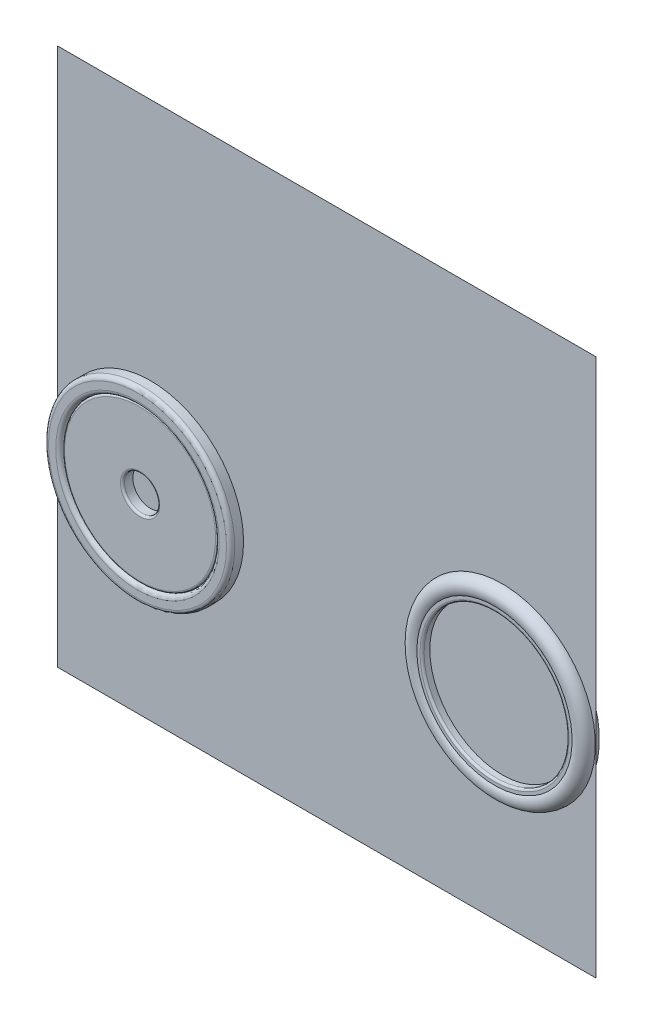
ISO-10303-21;
HEADER;
FILE_DESCRIPTION(('STEP AP214'),'2;1');
FILE_NAME('part.step','',(''),(''),'','','');
FILE_SCHEMA(('AUTOMOTIVE_DESIGN { 1 0 10303 214 1 1 1 1 }'));
ENDSEC;
DATA;
#1=APPLICATION_CONTEXT('core data for automotive mechanical design processes');
#2=APPLICATION_PROTOCOL_DEFINITION('international standard','automotive_design',2000,#1);
#3=PRODUCT_CONTEXT('',#1,'mechanical');
#4=PRODUCT('Part','Part','',(#3));
#5=PRODUCT_RELATED_PRODUCT_CATEGORY('part','',(#4));
#6=PRODUCT_DEFINITION_FORMATION('','',#4);
#7=PRODUCT_DEFINITION_CONTEXT('part definition',#1,'design');
#8=PRODUCT_DEFINITION('design','',#6,#7);
#9=PRODUCT_DEFINITION_SHAPE('','',#8);
#10=(LENGTH_UNIT() NAMED_UNIT(*) SI_UNIT(.MILLI.,.METRE.));
#11=(NAMED_UNIT(*) PLANE_ANGLE_UNIT() SI_UNIT($,.RADIAN.));
#12=(NAMED_UNIT(*) SI_UNIT($,.STERADIAN.) SOLID_ANGLE_UNIT());
#13=UNCERTAINTY_MEASURE_WITH_UNIT(LENGTH_MEASURE(1.E-05),#10,'distance_accuracy_value','');
#14=(GEOMETRIC_REPRESENTATION_CONTEXT(3) GLOBAL_UNCERTAINTY_ASSIGNED_CONTEXT((#13)) GLOBAL_UNIT_ASSIGNED_CONTEXT((#10,
#11,#12)) REPRESENTATION_CONTEXT('',''));
#15=CARTESIAN_POINT('',(0.,0.,0.));
#16=DIRECTION('',(0.,0.,1.));
#17=DIRECTION('',(1.,0.,0.));
#18=AXIS2_PLACEMENT_3D('',#15,#16,#17);
#19=CARTESIAN_POINT('',(33.9132523837955,-13.0433190309259,-9.60988797660178));
#20=DIRECTION('',(0.,0.,-1.));
#21=DIRECTION('',(-1.,0.,0.));
#22=AXIS2_PLACEMENT_3D('',#19,#20,#21);
#23=CYLINDRICAL_SURFACE('',#22,14.);
#24=CARTESIAN_POINT('',(33.9132523837955,-13.0433190309259,-1.1));
#25=DIRECTION('',(0.,0.,1.));
#26=DIRECTION('',(1.,0.,0.));
#27=AXIS2_PLACEMENT_3D('',#24,#25,#26);
#28=CIRCLE('',#27,14.);
#29=CARTESIAN_POINT('',(47.9132523837954,-13.0433190309259,-1.1));
#30=VERTEX_POINT('',#29);
#31=EDGE_CURVE('E56',#30,#30,#28,.F.);
#32=ORIENTED_EDGE('',*,*,#31,.T.);
#33=EDGE_LOOP('',(#32));
#34=FACE_BOUND('',#33,.T.);
#35=CARTESIAN_POINT('',(33.9132523837955,-13.0433190309259,1.1));
#36=DIRECTION('',(0.,0.,-1.));
#37=DIRECTION('',(-1.,0.,0.));
#38=AXIS2_PLACEMENT_3D('',#35,#36,#37);
#39=CIRCLE('',#38,14.);
#40=CARTESIAN_POINT('',(19.9132523837955,-13.0433190309259,1.1));
#41=VERTEX_POINT('',#40);
#42=EDGE_CURVE('E60',#41,#41,#39,.F.);
#43=ORIENTED_EDGE('',*,*,#42,.T.);
#44=EDGE_LOOP('',(#43));
#45=FACE_BOUND('',#44,.T.);
#46=ADVANCED_FACE('F45',(#34,#45),#23,.F.);
#47=CARTESIAN_POINT('',(47.9132523837954,-13.0433190309259,1.5));
#48=DIRECTION('',(0.,0.,-1.));
#49=DIRECTION('',(-1.,0.,0.));
#50=AXIS2_PLACEMENT_3D('',#47,#48,#49);
#51=PLANE('',#50);
#52=CARTESIAN_POINT('',(33.9132523837955,-13.0433190309259,1.5));
#53=DIRECTION('',(0.,0.,-1.));
#54=DIRECTION('',(-1.,0.,0.));
#55=AXIS2_PLACEMENT_3D('',#52,#53,#54);
#56=CIRCLE('',#55,14.4);
#57=CARTESIAN_POINT('',(19.5132523837955,-13.0433190309259,1.5));
#58=VERTEX_POINT('',#57);
#59=EDGE_CURVE('E11',#58,#58,#56,.T.);
#60=ORIENTED_EDGE('',*,*,#59,.T.);
#61=EDGE_LOOP('',(#60));
#62=FACE_BOUND('',#61,.T.);
#63=CARTESIAN_POINT('',(33.9132523837955,-13.0433190309259,1.5));
#64=DIRECTION('',(0.,0.,-1.));
#65=DIRECTION('',(-1.,0.,0.));
#66=AXIS2_PLACEMENT_3D('',#63,#64,#65);
#67=CIRCLE('',#66,15.);
#68=CARTESIAN_POINT('',(18.9132523837955,-13.0433190309259,1.5));
#69=VERTEX_POINT('',#68);
#70=EDGE_CURVE('E65',#69,#69,#67,.T.);
#71=ORIENTED_EDGE('',*,*,#70,.F.);
#72=EDGE_LOOP('',(#71));
#73=FACE_BOUND('',#72,.T.);
#74=ADVANCED_FACE('F77',(#62,#73),#51,.F.);
#75=CARTESIAN_POINT('',(33.9132523837955,-13.0433190309259,0.));
#76=DIRECTION('',(0.,0.,-1.));
#77=DIRECTION('',(-1.,0.,0.));
#78=AXIS2_PLACEMENT_3D('',#75,#76,#77);
#79=TOROIDAL_SURFACE('',#78,16.125,1.87500000000001);
#80=CARTESIAN_POINT('',(33.9132523837955,-13.0433190309259,-1.5));
#81=DIRECTION('',(0.,0.,-1.));
#82=DIRECTION('',(-1.,0.,0.));
#83=AXIS2_PLACEMENT_3D('',#80,#81,#82);
#84=CIRCLE('',#83,15.);
#85=CARTESIAN_POINT('',(18.9132523837955,-13.0433190309259,-1.5));
#86=VERTEX_POINT('',#85);
#87=EDGE_CURVE('E68',#86,#86,#84,.T.);
#88=ORIENTED_EDGE('',*,*,#87,.F.);
#89=EDGE_LOOP('',(#88));
#90=FACE_BOUND('',#89,.T.);
#91=ORIENTED_EDGE('',*,*,#70,.T.);
#92=EDGE_LOOP('',(#91));
#93=FACE_BOUND('',#92,.T.);
#94=ADVANCED_FACE('F74',(#90,#93),#79,.T.);
#95=CARTESIAN_POINT('',(48.9132523837955,-13.0433190309259,-1.5));
#96=DIRECTION('',(0.,0.,1.));
#97=DIRECTION('',(1.,0.,0.));
#98=AXIS2_PLACEMENT_3D('',#95,#96,#97);
#99=PLANE('',#98);
#100=CARTESIAN_POINT('',(33.9132523837955,-13.0433190309259,-1.5));
#101=DIRECTION('',(0.,0.,1.));
#102=DIRECTION('',(1.,0.,0.));
#103=AXIS2_PLACEMENT_3D('',#100,#101,#102);
#104=CIRCLE('',#103,14.4);
#105=CARTESIAN_POINT('',(48.3132523837954,-13.0433190309259,-1.5));
#106=VERTEX_POINT('',#105);
#107=EDGE_CURVE('E52',#106,#106,#104,.T.);
#108=ORIENTED_EDGE('',*,*,#107,.T.);
#109=EDGE_LOOP('',(#108));
#110=FACE_BOUND('',#109,.T.);
#111=ORIENTED_EDGE('',*,*,#87,.T.);
#112=EDGE_LOOP('',(#111));
#113=FACE_BOUND('',#112,.T.);
#114=ADVANCED_FACE('F72',(#110,#113),#99,.F.);
#115=CARTESIAN_POINT('',(33.9132523837955,-13.0433190309259,-1.1));
#116=DIRECTION('',(0.,0.,1.));
#117=DIRECTION('',(1.,0.,0.));
#118=AXIS2_PLACEMENT_3D('',#115,#116,#117);
#119=TOROIDAL_SURFACE('',#118,14.4,0.4);
#120=ORIENTED_EDGE('',*,*,#107,.F.);
#121=EDGE_LOOP('',(#120));
#122=FACE_BOUND('',#121,.T.);
#123=ORIENTED_EDGE('',*,*,#31,.F.);
#124=EDGE_LOOP('',(#123));
#125=FACE_BOUND('',#124,.T.);
#126=ADVANCED_FACE('F89',(#122,#125),#119,.T.);
#127=CARTESIAN_POINT('',(33.9132523837955,-13.0433190309259,1.1));
#128=DIRECTION('',(0.,0.,-1.));
#129=DIRECTION('',(-1.,0.,0.));
#130=AXIS2_PLACEMENT_3D('',#127,#128,#129);
#131=TOROIDAL_SURFACE('',#130,14.4,0.4);
#132=ORIENTED_EDGE('',*,*,#42,.F.);
#133=EDGE_LOOP('',(#132));
#134=FACE_BOUND('',#133,.T.);
#135=ORIENTED_EDGE('',*,*,#59,.F.);
#136=EDGE_LOOP('',(#135));
#137=FACE_BOUND('',#136,.T.);
#138=ADVANCED_FACE('F47',(#134,#137),#131,.T.);
#139=CLOSED_SHELL('',(#46,#74,#94,#114,#126,#138));
#140=MANIFOLD_SOLID_BREP('B2',#139);
#141=CARTESIAN_POINT('',(-34.0867476162045,-13.0433190309259,-2.5));
#142=DIRECTION('',(0.,0.,1.));
#143=DIRECTION('',(1.,0.,0.));
#144=AXIS2_PLACEMENT_3D('',#141,#142,#143);
#145=CYLINDRICAL_SURFACE('',#144,18.);
#146=CARTESIAN_POINT('',(-34.0867476162045,-13.0433190309259,-1.7));
#147=DIRECTION('',(0.,0.,1.));
#148=DIRECTION('',(1.,0.,0.));
#149=AXIS2_PLACEMENT_3D('',#146,#147,#148);
#150=CIRCLE('',#149,18.);
#151=CARTESIAN_POINT('',(-16.0867476162045,-13.0433190309259,-1.7));
#152=VERTEX_POINT('',#151);
#153=EDGE_CURVE('E155',#152,#152,#150,.T.);
#154=ORIENTED_EDGE('',*,*,#153,.T.);
#155=EDGE_LOOP('',(#154));
#156=FACE_BOUND('',#155,.T.);
#157=CARTESIAN_POINT('',(-34.0867476162045,-13.0433190309259,1.7));
#158=DIRECTION('',(0.,0.,1.));
#159=DIRECTION('',(1.,0.,0.));
#160=AXIS2_PLACEMENT_3D('',#157,#158,#159);
#161=CIRCLE('',#160,18.);
#162=CARTESIAN_POINT('',(-16.0867476162045,-13.0433190309259,1.7));
#163=VERTEX_POINT('',#162);
#164=EDGE_CURVE('E159',#163,#163,#161,.F.);
#165=ORIENTED_EDGE('',*,*,#164,.T.);
#166=EDGE_LOOP('',(#165));
#167=FACE_BOUND('',#166,.T.);
#168=ADVANCED_FACE('F144',(#156,#167),#145,.T.);
#169=CARTESIAN_POINT('',(-34.0867476162045,-13.0433190309259,-2.5));
#170=DIRECTION('',(0.,0.,1.));
#171=DIRECTION('',(1.,0.,0.));
#172=AXIS2_PLACEMENT_3D('',#169,#170,#171);
#173=PLANE('',#172);
#174=CARTESIAN_POINT('',(-34.0867476162045,-13.0433190309259,-2.5));
#175=DIRECTION('',(0.,0.,1.));
#176=DIRECTION('',(1.,0.,0.));
#177=AXIS2_PLACEMENT_3D('',#174,#175,#176);
#178=CIRCLE('',#177,15.8);
#179=CARTESIAN_POINT('',(-18.2867476162045,-13.0433190309259,-2.5));
#180=VERTEX_POINT('',#179);
#181=EDGE_CURVE('E170',#180,#180,#178,.T.);
#182=ORIENTED_EDGE('',*,*,#181,.T.);
#183=EDGE_LOOP('',(#182));
#184=FACE_BOUND('',#183,.T.);
#185=CARTESIAN_POINT('',(-34.0867476162045,-13.0433190309259,-2.5));
#186=DIRECTION('',(0.,0.,1.));
#187=DIRECTION('',(1.,0.,0.));
#188=AXIS2_PLACEMENT_3D('',#185,#186,#187);
#189=CIRCLE('',#188,17.2);
#190=CARTESIAN_POINT('',(-16.8867476162045,-13.0433190309259,-2.5));
#191=VERTEX_POINT('',#190);
#192=EDGE_CURVE('E173',#191,#191,#189,.F.);
#193=ORIENTED_EDGE('',*,*,#192,.T.);
#194=EDGE_LOOP('',(#193));
#195=FACE_BOUND('',#194,.T.);
#196=ADVANCED_FACE('F177',(#184,#195),#173,.F.);
#197=CARTESIAN_POINT('',(-34.0867476162045,-13.0433190309259,-2.5));
#198=DIRECTION('',(0.,0.,1.));
#199=DIRECTION('',(1.,0.,0.));
#200=AXIS2_PLACEMENT_3D('',#197,#198,#199);
#201=CYLINDRICAL_SURFACE('',#200,15.);
#202=CARTESIAN_POINT('',(-34.0867476162045,-13.0433190309259,-1.7));
#203=DIRECTION('',(0.,0.,1.));
#204=DIRECTION('',(1.,0.,0.));
#205=AXIS2_PLACEMENT_3D('',#202,#203,#204);
#206=CIRCLE('',#205,15.);
#207=CARTESIAN_POINT('',(-19.0867476162045,-13.0433190309259,-1.7));
#208=VERTEX_POINT('',#207);
#209=EDGE_CURVE('E164',#208,#208,#206,.F.);
#210=ORIENTED_EDGE('',*,*,#209,.T.);
#211=EDGE_LOOP('',(#210));
#212=FACE_BOUND('',#211,.T.);
#213=CARTESIAN_POINT('',(-34.0867476162045,-13.0433190309259,1.7));
#214=DIRECTION('',(0.,0.,1.));
#215=DIRECTION('',(1.,0.,0.));
#216=AXIS2_PLACEMENT_3D('',#213,#214,#215);
#217=CIRCLE('',#216,15.);
#218=CARTESIAN_POINT('',(-19.0867476162045,-13.0433190309259,1.7));
#219=VERTEX_POINT('',#218);
#220=EDGE_CURVE('E167',#219,#219,#217,.T.);
#221=ORIENTED_EDGE('',*,*,#220,.T.);
#222=EDGE_LOOP('',(#221));
#223=FACE_BOUND('',#222,.T.);
#224=ADVANCED_FACE('F208',(#212,#223),#201,.F.);
#225=CARTESIAN_POINT('',(-34.0867476162045,-13.0433190309259,2.5));
#226=DIRECTION('',(0.,0.,1.));
#227=DIRECTION('',(1.,0.,0.));
#228=AXIS2_PLACEMENT_3D('',#225,#226,#227);
#229=PLANE('',#228);
#230=CARTESIAN_POINT('',(-34.0867476162045,-13.0433190309259,2.5));
#231=DIRECTION('',(0.,0.,1.));
#232=DIRECTION('',(1.,0.,0.));
#233=AXIS2_PLACEMENT_3D('',#230,#231,#232);
#234=CIRCLE('',#233,15.8);
#235=CARTESIAN_POINT('',(-18.2867476162045,-13.0433190309259,2.5));
#236=VERTEX_POINT('',#235);
#237=EDGE_CURVE('E44',#236,#236,#234,.F.);
#238=ORIENTED_EDGE('',*,*,#237,.T.);
#239=EDGE_LOOP('',(#238));
#240=FACE_BOUND('',#239,.T.);
#241=CARTESIAN_POINT('',(-34.0867476162045,-13.0433190309259,2.5));
#242=DIRECTION('',(0.,0.,1.));
#243=DIRECTION('',(1.,0.,0.));
#244=AXIS2_PLACEMENT_3D('',#241,#242,#243);
#245=CIRCLE('',#244,17.2);
#246=CARTESIAN_POINT('',(-16.8867476162045,-13.0433190309259,2.5));
#247=VERTEX_POINT('',#246);
#248=EDGE_CURVE('E151',#247,#247,#245,.T.);
#249=ORIENTED_EDGE('',*,*,#248,.T.);
#250=EDGE_LOOP('',(#249));
#251=FACE_BOUND('',#250,.T.);
#252=ADVANCED_FACE('F203',(#240,#251),#229,.T.);
#253=CARTESIAN_POINT('',(-34.0867476162045,-13.0433190309259,-1.7));
#254=DIRECTION('',(0.,0.,1.));
#255=DIRECTION('',(1.,0.,0.));
#256=AXIS2_PLACEMENT_3D('',#253,#254,#255);
#257=TOROIDAL_SURFACE('',#256,15.8,0.8);
#258=ORIENTED_EDGE('',*,*,#209,.F.);
#259=EDGE_LOOP('',(#258));
#260=FACE_BOUND('',#259,.T.);
#261=ORIENTED_EDGE('',*,*,#181,.F.);
#262=EDGE_LOOP('',(#261));
#263=FACE_BOUND('',#262,.T.);
#264=ADVANCED_FACE('F183',(#260,#263),#257,.T.);
#265=CARTESIAN_POINT('',(-34.0867476162045,-13.0433190309259,-1.7));
#266=DIRECTION('',(0.,0.,1.));
#267=DIRECTION('',(1.,0.,0.));
#268=AXIS2_PLACEMENT_3D('',#265,#266,#267);
#269=TOROIDAL_SURFACE('',#268,17.2,0.8);
#270=ORIENTED_EDGE('',*,*,#192,.F.);
#271=EDGE_LOOP('',(#270));
#272=FACE_BOUND('',#271,.T.);
#273=ORIENTED_EDGE('',*,*,#153,.F.);
#274=EDGE_LOOP('',(#273));
#275=FACE_BOUND('',#274,.T.);
#276=ADVANCED_FACE('F179',(#272,#275),#269,.T.);
#277=CARTESIAN_POINT('',(-34.0867476162045,-13.0433190309259,1.7));
#278=DIRECTION('',(0.,0.,1.));
#279=DIRECTION('',(1.,0.,0.));
#280=AXIS2_PLACEMENT_3D('',#277,#278,#279);
#281=TOROIDAL_SURFACE('',#280,15.8,0.8);
#282=ORIENTED_EDGE('',*,*,#237,.F.);
#283=EDGE_LOOP('',(#282));
#284=FACE_BOUND('',#283,.T.);
#285=ORIENTED_EDGE('',*,*,#220,.F.);
#286=EDGE_LOOP('',(#285));
#287=FACE_BOUND('',#286,.T.);
#288=ADVANCED_FACE('F182',(#284,#287),#281,.T.);
#289=CARTESIAN_POINT('',(-34.0867476162045,-13.0433190309259,1.7));
#290=DIRECTION('',(0.,0.,1.));
#291=DIRECTION('',(1.,0.,0.));
#292=AXIS2_PLACEMENT_3D('',#289,#290,#291);
#293=TOROIDAL_SURFACE('',#292,17.2,0.8);
#294=ORIENTED_EDGE('',*,*,#164,.F.);
#295=EDGE_LOOP('',(#294));
#296=FACE_BOUND('',#295,.T.);
#297=ORIENTED_EDGE('',*,*,#248,.F.);
#298=EDGE_LOOP('',(#297));
#299=FACE_BOUND('',#298,.T.);
#300=ADVANCED_FACE('F146',(#296,#299),#293,.T.);
#301=CLOSED_SHELL('',(#168,#196,#224,#252,#264,#276,#288,#300));
#302=MANIFOLD_SOLID_BREP('B6',#301);
#303=CARTESIAN_POINT('',(-34.0867476162045,-13.0433190309259,-2.));
#304=DIRECTION('',(0.,0.,1.));
#305=DIRECTION('',(1.,0.,0.));
#306=AXIS2_PLACEMENT_3D('',#303,#304,#305);
#307=CYLINDRICAL_SURFACE('',#306,15.);
#308=CARTESIAN_POINT('',(-34.0867476162045,-13.0433190309259,-1.6));
#309=DIRECTION('',(0.,0.,1.));
#310=DIRECTION('',(1.,0.,0.));
#311=AXIS2_PLACEMENT_3D('',#308,#309,#310);
#312=CIRCLE('',#311,15.);
#313=CARTESIAN_POINT('',(-19.0867476162045,-13.0433190309259,-1.6));
#314=VERTEX_POINT('',#313);
#315=EDGE_CURVE('E300',#314,#314,#312,.T.);
#316=ORIENTED_EDGE('',*,*,#315,.T.);
#317=EDGE_LOOP('',(#316));
#318=FACE_BOUND('',#317,.T.);
#319=CARTESIAN_POINT('',(-34.0867476162045,-13.0433190309259,1.6));
#320=DIRECTION('',(0.,0.,1.));
#321=DIRECTION('',(1.,0.,0.));
#322=AXIS2_PLACEMENT_3D('',#319,#320,#321);
#323=CIRCLE('',#322,15.);
#324=CARTESIAN_POINT('',(-19.0867476162045,-13.0433190309259,1.6));
#325=VERTEX_POINT('',#324);
#326=EDGE_CURVE('E303',#325,#325,#323,.F.);
#327=ORIENTED_EDGE('',*,*,#326,.T.);
#328=EDGE_LOOP('',(#327));
#329=FACE_BOUND('',#328,.T.);
#330=ADVANCED_FACE('F274',(#318,#329),#307,.T.);
#331=CARTESIAN_POINT('',(-34.0867476162045,-13.0433190309259,-2.));
#332=DIRECTION('',(0.,0.,1.));
#333=DIRECTION('',(1.,0.,0.));
#334=AXIS2_PLACEMENT_3D('',#331,#332,#333);
#335=PLANE('',#334);
#336=CARTESIAN_POINT('',(-34.0867476162045,-13.0433190309259,-2.));
#337=DIRECTION('',(0.,0.,1.));
#338=DIRECTION('',(1.,0.,0.));
#339=AXIS2_PLACEMENT_3D('',#336,#337,#338);
#340=CIRCLE('',#339,14.6);
#341=CARTESIAN_POINT('',(-19.4867476162045,-13.0433190309259,-2.));
#342=VERTEX_POINT('',#341);
#343=EDGE_CURVE('E294',#342,#342,#340,.F.);
#344=ORIENTED_EDGE('',*,*,#343,.T.);
#345=EDGE_LOOP('',(#344));
#346=FACE_BOUND('',#345,.T.);
#347=CARTESIAN_POINT('',(-34.0867476162045,-13.0433190309259,-2.));
#348=DIRECTION('',(0.,0.,1.));
#349=DIRECTION('',(1.,0.,0.));
#350=AXIS2_PLACEMENT_3D('',#347,#348,#349);
#351=CIRCLE('',#350,3.8);
#352=CARTESIAN_POINT('',(-30.2867476162045,-13.0433190309259,-2.));
#353=VERTEX_POINT('',#352);
#354=EDGE_CURVE('E297',#353,#353,#351,.T.);
#355=ORIENTED_EDGE('',*,*,#354,.T.);
#356=EDGE_LOOP('',(#355));
#357=FACE_BOUND('',#356,.T.);
#358=ADVANCED_FACE('F317',(#346,#357),#335,.F.);
#359=CARTESIAN_POINT('',(-34.0867476162045,-13.0433190309259,-2.));
#360=DIRECTION('',(0.,0.,1.));
#361=DIRECTION('',(1.,0.,0.));
#362=AXIS2_PLACEMENT_3D('',#359,#360,#361);
#363=CYLINDRICAL_SURFACE('',#362,3.4);
#364=CARTESIAN_POINT('',(-34.0867476162045,-13.0433190309259,-1.6));
#365=DIRECTION('',(0.,0.,1.));
#366=DIRECTION('',(1.,0.,0.));
#367=AXIS2_PLACEMENT_3D('',#364,#365,#366);
#368=CIRCLE('',#367,3.4);
#369=CARTESIAN_POINT('',(-30.6867476162045,-13.0433190309259,-1.6));
#370=VERTEX_POINT('',#369);
#371=EDGE_CURVE('E285',#370,#370,#368,.F.);
#372=ORIENTED_EDGE('',*,*,#371,.T.);
#373=EDGE_LOOP('',(#372));
#374=FACE_BOUND('',#373,.T.);
#375=CARTESIAN_POINT('',(-34.0867476162045,-13.0433190309259,1.6));
#376=DIRECTION('',(0.,0.,1.));
#377=DIRECTION('',(1.,0.,0.));
#378=AXIS2_PLACEMENT_3D('',#375,#376,#377);
#379=CIRCLE('',#378,3.4);
#380=CARTESIAN_POINT('',(-30.6867476162045,-13.0433190309259,1.6));
#381=VERTEX_POINT('',#380);
#382=EDGE_CURVE('E289',#381,#381,#379,.T.);
#383=ORIENTED_EDGE('',*,*,#382,.T.);
#384=EDGE_LOOP('',(#383));
#385=FACE_BOUND('',#384,.T.);
#386=ADVANCED_FACE('F323',(#374,#385),#363,.F.);
#387=CARTESIAN_POINT('',(-34.0867476162045,-13.0433190309259,2.));
#388=DIRECTION('',(0.,0.,1.));
#389=DIRECTION('',(1.,0.,0.));
#390=AXIS2_PLACEMENT_3D('',#387,#388,#389);
#391=PLANE('',#390);
#392=CARTESIAN_POINT('',(-34.0867476162045,-13.0433190309259,2.));
#393=DIRECTION('',(0.,0.,1.));
#394=DIRECTION('',(1.,0.,0.));
#395=AXIS2_PLACEMENT_3D('',#392,#393,#394);
#396=CIRCLE('',#395,3.8);
#397=CARTESIAN_POINT('',(-30.2867476162045,-13.0433190309259,2.));
#398=VERTEX_POINT('',#397);
#399=EDGE_CURVE('E143',#398,#398,#396,.F.);
#400=ORIENTED_EDGE('',*,*,#399,.T.);
#401=EDGE_LOOP('',(#400));
#402=FACE_BOUND('',#401,.T.);
#403=CARTESIAN_POINT('',(-34.0867476162045,-13.0433190309259,2.));
#404=DIRECTION('',(0.,0.,1.));
#405=DIRECTION('',(1.,0.,0.));
#406=AXIS2_PLACEMENT_3D('',#403,#404,#405);
#407=CIRCLE('',#406,14.6);
#408=CARTESIAN_POINT('',(-19.4867476162045,-13.0433190309259,2.));
#409=VERTEX_POINT('',#408);
#410=EDGE_CURVE('E281',#409,#409,#407,.T.);
#411=ORIENTED_EDGE('',*,*,#410,.T.);
#412=EDGE_LOOP('',(#411));
#413=FACE_BOUND('',#412,.T.);
#414=ADVANCED_FACE('F331',(#402,#413),#391,.T.);
#415=CARTESIAN_POINT('',(-34.0867476162045,-13.0433190309259,-1.6));
#416=DIRECTION('',(0.,0.,1.));
#417=DIRECTION('',(1.,0.,0.));
#418=AXIS2_PLACEMENT_3D('',#415,#416,#417);
#419=TOROIDAL_SURFACE('',#418,14.6,0.4);
#420=ORIENTED_EDGE('',*,*,#343,.F.);
#421=EDGE_LOOP('',(#420));
#422=FACE_BOUND('',#421,.T.);
#423=ORIENTED_EDGE('',*,*,#315,.F.);
#424=EDGE_LOOP('',(#423));
#425=FACE_BOUND('',#424,.T.);
#426=ADVANCED_FACE('F328',(#422,#425),#419,.T.);
#427=CARTESIAN_POINT('',(-34.0867476162045,-13.0433190309259,-1.6));
#428=DIRECTION('',(0.,0.,1.));
#429=DIRECTION('',(1.,0.,0.));
#430=AXIS2_PLACEMENT_3D('',#427,#428,#429);
#431=TOROIDAL_SURFACE('',#430,3.8,0.4);
#432=ORIENTED_EDGE('',*,*,#371,.F.);
#433=EDGE_LOOP('',(#432));
#434=FACE_BOUND('',#433,.T.);
#435=ORIENTED_EDGE('',*,*,#354,.F.);
#436=EDGE_LOOP('',(#435));
#437=FACE_BOUND('',#436,.T.);
#438=ADVANCED_FACE('F314',(#434,#437),#431,.T.);
#439=CARTESIAN_POINT('',(-34.0867476162045,-13.0433190309259,1.6));
#440=DIRECTION('',(0.,0.,1.));
#441=DIRECTION('',(1.,0.,0.));
#442=AXIS2_PLACEMENT_3D('',#439,#440,#441);
#443=TOROIDAL_SURFACE('',#442,3.8,0.4);
#444=ORIENTED_EDGE('',*,*,#399,.F.);
#445=EDGE_LOOP('',(#444));
#446=FACE_BOUND('',#445,.T.);
#447=ORIENTED_EDGE('',*,*,#382,.F.);
#448=EDGE_LOOP('',(#447));
#449=FACE_BOUND('',#448,.T.);
#450=ADVANCED_FACE('F310',(#446,#449),#443,.T.);
#451=CARTESIAN_POINT('',(-34.0867476162045,-13.0433190309259,1.6));
#452=DIRECTION('',(0.,0.,1.));
#453=DIRECTION('',(1.,0.,0.));
#454=AXIS2_PLACEMENT_3D('',#451,#452,#453);
#455=TOROIDAL_SURFACE('',#454,14.6,0.4);
#456=ORIENTED_EDGE('',*,*,#326,.F.);
#457=EDGE_LOOP('',(#456));
#458=FACE_BOUND('',#457,.T.);
#459=ORIENTED_EDGE('',*,*,#410,.F.);
#460=EDGE_LOOP('',(#459));
#461=FACE_BOUND('',#460,.T.);
#462=ADVANCED_FACE('F276',(#458,#461),#455,.T.);
#463=CLOSED_SHELL('',(#330,#358,#386,#414,#426,#438,#450,#462));
#464=MANIFOLD_SOLID_BREP('B39',#463);
#465=CARTESIAN_POINT('',(0.,0.,0.));
#466=DIRECTION('',(0.,0.,1.));
#467=DIRECTION('',(1.,0.,0.));
#468=AXIS2_PLACEMENT_3D('',#465,#466,#467);
#469=PLANE('',#468);
#470=DIRECTION('',(0.,-1.,0.));
#471=VECTOR('',#470,1.);
#472=CARTESIAN_POINT('',(-52.,-52.,0.));
#473=LINE('',#472,#471);
#474=CARTESIAN_POINT('',(-52.,52.,0.));
#475=VERTEX_POINT('',#474);
#476=CARTESIAN_POINT('',(-52.,-52.,0.));
#477=VERTEX_POINT('',#476);
#478=EDGE_CURVE('E404',#475,#477,#473,.T.);
#479=ORIENTED_EDGE('',*,*,#478,.T.);
#480=DIRECTION('',(1.,0.,0.));
#481=VECTOR('',#480,1.);
#482=CARTESIAN_POINT('',(52.,-52.,0.));
#483=LINE('',#482,#481);
#484=CARTESIAN_POINT('',(52.,-52.,0.));
#485=VERTEX_POINT('',#484);
#486=EDGE_CURVE('E415',#477,#485,#483,.T.);
#487=ORIENTED_EDGE('',*,*,#486,.T.);
#488=DIRECTION('',(0.,1.,0.));
#489=VECTOR('',#488,1.);
#490=CARTESIAN_POINT('',(52.,-52.,0.));
#491=LINE('',#490,#489);
#492=CARTESIAN_POINT('',(52.,52.,0.));
#493=VERTEX_POINT('',#492);
#494=EDGE_CURVE('E400',#485,#493,#491,.T.);
#495=ORIENTED_EDGE('',*,*,#494,.T.);
#496=DIRECTION('',(-1.,0.,0.));
#497=VECTOR('',#496,1.);
#498=CARTESIAN_POINT('',(52.,52.,0.));
#499=LINE('',#498,#497);
#500=EDGE_CURVE('E272',#493,#475,#499,.T.);
#501=ORIENTED_EDGE('',*,*,#500,.T.);
#502=EDGE_LOOP('',(#479,#487,#495,#501));
#503=FACE_BOUND('',#502,.T.);
#504=ADVANCED_FACE('F395',(#503),#469,.T.);
#505=OPEN_SHELL('',(#504));
#506=SHELL_BASED_SURFACE_MODEL('B138',(#505));
#507=ADVANCED_BREP_SHAPE_REPRESENTATION('',(#18,#140,#302,#464),#14);
#508=MANIFOLD_SURFACE_SHAPE_REPRESENTATION('',(#18,#506),#14);
#509=SHAPE_REPRESENTATION('',(#18),#14);
#510=SHAPE_DEFINITION_REPRESENTATION(#9,#509);
#511=SHAPE_REPRESENTATION_RELATIONSHIP('','',#509,#507);
#512=SHAPE_REPRESENTATION_RELATIONSHIP('','',#509,#508);
ENDSEC;
END-ISO-10303-21;
